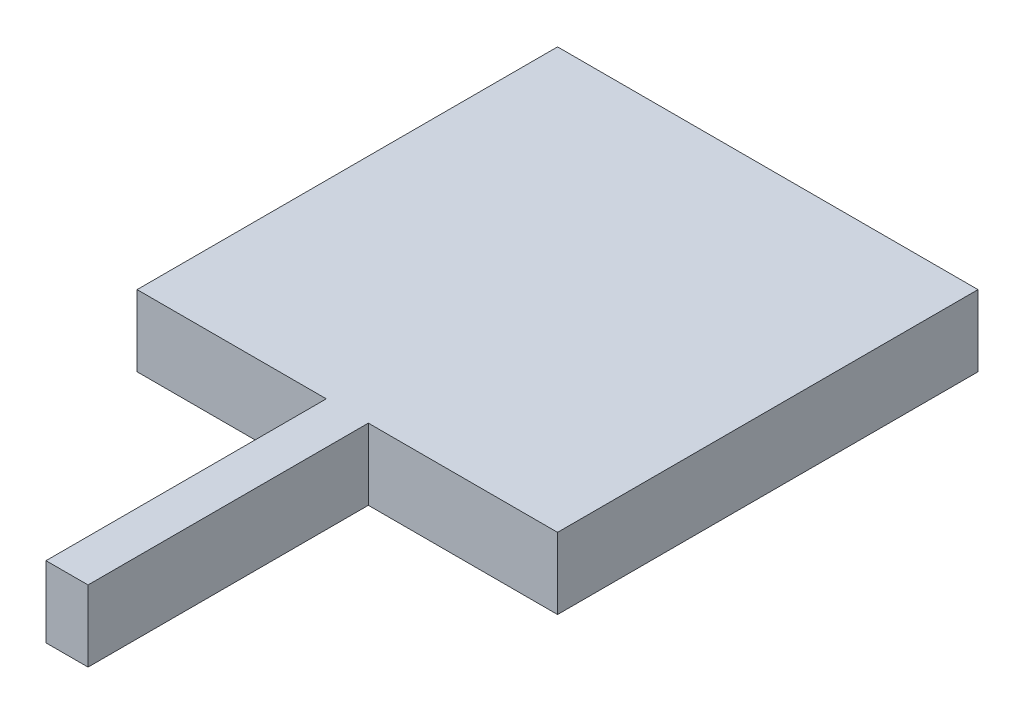
ISO-10303-21;
HEADER;
FILE_DESCRIPTION(('STEP AP214'),'2;1');
FILE_NAME('part.step','',(''),(''),'','','');
FILE_SCHEMA(('AUTOMOTIVE_DESIGN { 1 0 10303 214 1 1 1 1 }'));
ENDSEC;
DATA;
#1=APPLICATION_CONTEXT('core data for automotive mechanical design processes');
#2=APPLICATION_PROTOCOL_DEFINITION('international standard','automotive_design',2000,#1);
#3=PRODUCT_CONTEXT('',#1,'mechanical');
#4=PRODUCT('Part','Part','',(#3));
#5=PRODUCT_RELATED_PRODUCT_CATEGORY('part','',(#4));
#6=PRODUCT_DEFINITION_FORMATION('','',#4);
#7=PRODUCT_DEFINITION_CONTEXT('part definition',#1,'design');
#8=PRODUCT_DEFINITION('design','',#6,#7);
#9=PRODUCT_DEFINITION_SHAPE('','',#8);
#10=(LENGTH_UNIT() NAMED_UNIT(*) SI_UNIT(.MILLI.,.METRE.));
#11=(NAMED_UNIT(*) PLANE_ANGLE_UNIT() SI_UNIT($,.RADIAN.));
#12=(NAMED_UNIT(*) SI_UNIT($,.STERADIAN.) SOLID_ANGLE_UNIT());
#13=UNCERTAINTY_MEASURE_WITH_UNIT(LENGTH_MEASURE(1.E-05),#10,'distance_accuracy_value','');
#14=(GEOMETRIC_REPRESENTATION_CONTEXT(3) GLOBAL_UNCERTAINTY_ASSIGNED_CONTEXT((#13)) GLOBAL_UNIT_ASSIGNED_CONTEXT((#10,
#11,#12)) REPRESENTATION_CONTEXT('',''));
#15=CARTESIAN_POINT('',(0.,0.,0.));
#16=DIRECTION('',(0.,0.,1.));
#17=DIRECTION('',(1.,0.,0.));
#18=AXIS2_PLACEMENT_3D('',#15,#16,#17);
#19=CARTESIAN_POINT('',(0.,5.08,0.));
#20=DIRECTION('',(0.,0.,-1.));
#21=DIRECTION('',(-1.,0.,0.));
#22=AXIS2_PLACEMENT_3D('',#19,#20,#21);
#23=PLANE('',#22);
#24=DIRECTION('',(1.,0.,0.));
#25=VECTOR('',#24,1.);
#26=CARTESIAN_POINT('',(0.,0.,0.));
#27=LINE('',#26,#25);
#28=CARTESIAN_POINT('',(0.,0.,0.));
#29=VERTEX_POINT('',#28);
#30=CARTESIAN_POINT('',(13.5,0.,0.));
#31=VERTEX_POINT('',#30);
#32=EDGE_CURVE('E134',#29,#31,#27,.T.);
#33=ORIENTED_EDGE('',*,*,#32,.T.);
#34=DIRECTION('',(0.,-1.,0.));
#35=VECTOR('',#34,1.);
#36=CARTESIAN_POINT('',(13.5,5.08,0.));
#37=LINE('',#36,#35);
#38=CARTESIAN_POINT('',(13.5,5.08,0.));
#39=VERTEX_POINT('',#38);
#40=EDGE_CURVE('E11',#39,#31,#37,.T.);
#41=ORIENTED_EDGE('',*,*,#40,.F.);
#42=DIRECTION('',(1.,0.,0.));
#43=VECTOR('',#42,1.);
#44=CARTESIAN_POINT('',(0.,5.08,0.));
#45=LINE('',#44,#43);
#46=CARTESIAN_POINT('',(0.,5.08,0.));
#47=VERTEX_POINT('',#46);
#48=EDGE_CURVE('E151',#47,#39,#45,.T.);
#49=ORIENTED_EDGE('',*,*,#48,.F.);
#50=DIRECTION('',(0.,-1.,0.));
#51=VECTOR('',#50,1.);
#52=CARTESIAN_POINT('',(0.,5.08,0.));
#53=LINE('',#52,#51);
#54=EDGE_CURVE('E52',#47,#29,#53,.T.);
#55=ORIENTED_EDGE('',*,*,#54,.T.);
#56=EDGE_LOOP('',(#33,#41,#49,#55));
#57=FACE_BOUND('',#56,.T.);
#58=ADVANCED_FACE('F35',(#57),#23,.F.);
#59=CARTESIAN_POINT('',(13.5,5.08,0.));
#60=DIRECTION('',(1.,0.,0.));
#61=DIRECTION('',(0.,0.,-1.));
#62=AXIS2_PLACEMENT_3D('',#59,#60,#61);
#63=PLANE('',#62);
#64=DIRECTION('',(0.,0.,1.));
#65=VECTOR('',#64,1.);
#66=CARTESIAN_POINT('',(13.5,0.,0.));
#67=LINE('',#66,#65);
#68=CARTESIAN_POINT('',(13.5,0.,20.));
#69=VERTEX_POINT('',#68);
#70=EDGE_CURVE('E136',#31,#69,#67,.T.);
#71=ORIENTED_EDGE('',*,*,#70,.T.);
#72=DIRECTION('',(0.,-1.,0.));
#73=VECTOR('',#72,1.);
#74=CARTESIAN_POINT('',(13.5,5.08,20.));
#75=LINE('',#74,#73);
#76=CARTESIAN_POINT('',(13.5,5.08,20.));
#77=VERTEX_POINT('',#76);
#78=EDGE_CURVE('E44',#77,#69,#75,.T.);
#79=ORIENTED_EDGE('',*,*,#78,.F.);
#80=DIRECTION('',(0.,0.,1.));
#81=VECTOR('',#80,1.);
#82=CARTESIAN_POINT('',(13.5,5.08,0.));
#83=LINE('',#82,#81);
#84=EDGE_CURVE('E90',#39,#77,#83,.T.);
#85=ORIENTED_EDGE('',*,*,#84,.F.);
#86=ORIENTED_EDGE('',*,*,#40,.T.);
#87=EDGE_LOOP('',(#71,#79,#85,#86));
#88=FACE_BOUND('',#87,.T.);
#89=ADVANCED_FACE('F37',(#88),#63,.F.);
#90=CARTESIAN_POINT('',(0.,5.08,20.));
#91=DIRECTION('',(0.,0.,-1.));
#92=DIRECTION('',(-1.,0.,0.));
#93=AXIS2_PLACEMENT_3D('',#90,#91,#92);
#94=PLANE('',#93);
#95=DIRECTION('',(1.,0.,0.));
#96=VECTOR('',#95,1.);
#97=CARTESIAN_POINT('',(0.,0.,20.));
#98=LINE('',#97,#96);
#99=CARTESIAN_POINT('',(16.5,0.,20.));
#100=VERTEX_POINT('',#99);
#101=EDGE_CURVE('E139',#69,#100,#98,.T.);
#102=ORIENTED_EDGE('',*,*,#101,.T.);
#103=DIRECTION('',(0.,-1.,0.));
#104=VECTOR('',#103,1.);
#105=CARTESIAN_POINT('',(16.5,5.08,20.));
#106=LINE('',#105,#104);
#107=CARTESIAN_POINT('',(16.5,5.08,20.));
#108=VERTEX_POINT('',#107);
#109=EDGE_CURVE('E157',#108,#100,#106,.T.);
#110=ORIENTED_EDGE('',*,*,#109,.F.);
#111=DIRECTION('',(1.,0.,0.));
#112=VECTOR('',#111,1.);
#113=CARTESIAN_POINT('',(0.,5.08,20.));
#114=LINE('',#113,#112);
#115=EDGE_CURVE('E164',#77,#108,#114,.T.);
#116=ORIENTED_EDGE('',*,*,#115,.F.);
#117=ORIENTED_EDGE('',*,*,#78,.T.);
#118=EDGE_LOOP('',(#102,#110,#116,#117));
#119=FACE_BOUND('',#118,.T.);
#120=ADVANCED_FACE('F162',(#119),#94,.F.);
#121=CARTESIAN_POINT('',(16.5,5.08,0.));
#122=DIRECTION('',(1.,0.,0.));
#123=DIRECTION('',(0.,0.,-1.));
#124=AXIS2_PLACEMENT_3D('',#121,#122,#123);
#125=PLANE('',#124);
#126=DIRECTION('',(0.,0.,1.));
#127=VECTOR('',#126,1.);
#128=CARTESIAN_POINT('',(16.5,0.,0.));
#129=LINE('',#128,#127);
#130=CARTESIAN_POINT('',(16.5,0.,0.));
#131=VERTEX_POINT('',#130);
#132=EDGE_CURVE('E142',#131,#100,#129,.T.);
#133=ORIENTED_EDGE('',*,*,#132,.F.);
#134=DIRECTION('',(0.,-1.,0.));
#135=VECTOR('',#134,1.);
#136=CARTESIAN_POINT('',(16.5,5.08,0.));
#137=LINE('',#136,#135);
#138=CARTESIAN_POINT('',(16.5,5.08,0.));
#139=VERTEX_POINT('',#138);
#140=EDGE_CURVE('E155',#139,#131,#137,.T.);
#141=ORIENTED_EDGE('',*,*,#140,.F.);
#142=DIRECTION('',(0.,0.,1.));
#143=VECTOR('',#142,1.);
#144=CARTESIAN_POINT('',(16.5,5.08,0.));
#145=LINE('',#144,#143);
#146=EDGE_CURVE('E172',#139,#108,#145,.T.);
#147=ORIENTED_EDGE('',*,*,#146,.T.);
#148=ORIENTED_EDGE('',*,*,#109,.T.);
#149=EDGE_LOOP('',(#133,#141,#147,#148));
#150=FACE_BOUND('',#149,.T.);
#151=ADVANCED_FACE('F170',(#150),#125,.T.);
#152=CARTESIAN_POINT('',(30.,0.,0.));
#153=VERTEX_POINT('',#152);
#154=EDGE_CURVE('E137',#131,#153,#27,.T.);
#155=ORIENTED_EDGE('',*,*,#154,.T.);
#156=DIRECTION('',(0.,-1.,0.));
#157=VECTOR('',#156,1.);
#158=CARTESIAN_POINT('',(30.,5.08,0.));
#159=LINE('',#158,#157);
#160=CARTESIAN_POINT('',(30.,5.08,0.));
#161=VERTEX_POINT('',#160);
#162=EDGE_CURVE('E126',#161,#153,#159,.T.);
#163=ORIENTED_EDGE('',*,*,#162,.F.);
#164=EDGE_CURVE('E114',#139,#161,#45,.T.);
#165=ORIENTED_EDGE('',*,*,#164,.F.);
#166=ORIENTED_EDGE('',*,*,#140,.T.);
#167=EDGE_LOOP('',(#155,#163,#165,#166));
#168=FACE_BOUND('',#167,.T.);
#169=ADVANCED_FACE('F183',(#168),#23,.F.);
#170=CARTESIAN_POINT('',(30.,5.08,0.));
#171=DIRECTION('',(-1.,0.,0.));
#172=DIRECTION('',(0.,0.,1.));
#173=AXIS2_PLACEMENT_3D('',#170,#171,#172);
#174=PLANE('',#173);
#175=DIRECTION('',(0.,0.,-1.));
#176=VECTOR('',#175,1.);
#177=CARTESIAN_POINT('',(30.,0.,0.));
#178=LINE('',#177,#176);
#179=CARTESIAN_POINT('',(30.,0.,-30.));
#180=VERTEX_POINT('',#179);
#181=EDGE_CURVE('E123',#153,#180,#178,.T.);
#182=ORIENTED_EDGE('',*,*,#181,.T.);
#183=DIRECTION('',(0.,-1.,0.));
#184=VECTOR('',#183,1.);
#185=CARTESIAN_POINT('',(30.,5.08,-30.));
#186=LINE('',#185,#184);
#187=CARTESIAN_POINT('',(30.,5.08,-30.));
#188=VERTEX_POINT('',#187);
#189=EDGE_CURVE('E120',#188,#180,#186,.T.);
#190=ORIENTED_EDGE('',*,*,#189,.F.);
#191=DIRECTION('',(0.,0.,-1.));
#192=VECTOR('',#191,1.);
#193=CARTESIAN_POINT('',(30.,5.08,0.));
#194=LINE('',#193,#192);
#195=EDGE_CURVE('E106',#161,#188,#194,.T.);
#196=ORIENTED_EDGE('',*,*,#195,.F.);
#197=ORIENTED_EDGE('',*,*,#162,.T.);
#198=EDGE_LOOP('',(#182,#190,#196,#197));
#199=FACE_BOUND('',#198,.T.);
#200=ADVANCED_FACE('F121',(#199),#174,.F.);
#201=CARTESIAN_POINT('',(0.,5.08,-30.));
#202=DIRECTION('',(0.,0.,-1.));
#203=DIRECTION('',(-1.,0.,0.));
#204=AXIS2_PLACEMENT_3D('',#201,#202,#203);
#205=PLANE('',#204);
#206=DIRECTION('',(1.,0.,0.));
#207=VECTOR('',#206,1.);
#208=CARTESIAN_POINT('',(0.,0.,-30.));
#209=LINE('',#208,#207);
#210=CARTESIAN_POINT('',(0.,0.,-30.));
#211=VERTEX_POINT('',#210);
#212=EDGE_CURVE('E146',#211,#180,#209,.T.);
#213=ORIENTED_EDGE('',*,*,#212,.F.);
#214=DIRECTION('',(0.,-1.,0.));
#215=VECTOR('',#214,1.);
#216=CARTESIAN_POINT('',(0.,5.08,-30.));
#217=LINE('',#216,#215);
#218=CARTESIAN_POINT('',(0.,5.08,-30.));
#219=VERTEX_POINT('',#218);
#220=EDGE_CURVE('E78',#219,#211,#217,.T.);
#221=ORIENTED_EDGE('',*,*,#220,.F.);
#222=DIRECTION('',(1.,0.,0.));
#223=VECTOR('',#222,1.);
#224=CARTESIAN_POINT('',(0.,5.08,-30.));
#225=LINE('',#224,#223);
#226=EDGE_CURVE('E111',#219,#188,#225,.T.);
#227=ORIENTED_EDGE('',*,*,#226,.T.);
#228=ORIENTED_EDGE('',*,*,#189,.T.);
#229=EDGE_LOOP('',(#213,#221,#227,#228));
#230=FACE_BOUND('',#229,.T.);
#231=ADVANCED_FACE('F128',(#230),#205,.T.);
#232=CARTESIAN_POINT('',(0.,5.08,0.));
#233=DIRECTION('',(-1.,0.,0.));
#234=DIRECTION('',(0.,0.,1.));
#235=AXIS2_PLACEMENT_3D('',#232,#233,#234);
#236=PLANE('',#235);
#237=DIRECTION('',(0.,0.,-1.));
#238=VECTOR('',#237,1.);
#239=CARTESIAN_POINT('',(0.,0.,0.));
#240=LINE('',#239,#238);
#241=EDGE_CURVE('E148',#29,#211,#240,.T.);
#242=ORIENTED_EDGE('',*,*,#241,.F.);
#243=ORIENTED_EDGE('',*,*,#54,.F.);
#244=DIRECTION('',(0.,0.,-1.));
#245=VECTOR('',#244,1.);
#246=CARTESIAN_POINT('',(0.,5.08,0.));
#247=LINE('',#246,#245);
#248=EDGE_CURVE('E129',#47,#219,#247,.T.);
#249=ORIENTED_EDGE('',*,*,#248,.T.);
#250=ORIENTED_EDGE('',*,*,#220,.T.);
#251=EDGE_LOOP('',(#242,#243,#249,#250));
#252=FACE_BOUND('',#251,.T.);
#253=ADVANCED_FACE('F194',(#252),#236,.T.);
#254=CARTESIAN_POINT('',(0.,5.08,0.));
#255=DIRECTION('',(0.,1.,0.));
#256=DIRECTION('',(0.,0.,1.));
#257=AXIS2_PLACEMENT_3D('',#254,#255,#256);
#258=PLANE('',#257);
#259=ORIENTED_EDGE('',*,*,#48,.T.);
#260=ORIENTED_EDGE('',*,*,#84,.T.);
#261=ORIENTED_EDGE('',*,*,#115,.T.);
#262=ORIENTED_EDGE('',*,*,#146,.F.);
#263=ORIENTED_EDGE('',*,*,#164,.T.);
#264=ORIENTED_EDGE('',*,*,#195,.T.);
#265=ORIENTED_EDGE('',*,*,#226,.F.);
#266=ORIENTED_EDGE('',*,*,#248,.F.);
#267=EDGE_LOOP('',(#259,#260,#261,#262,#263,#264,#265,#266));
#268=FACE_BOUND('',#267,.T.);
#269=ADVANCED_FACE('F108',(#268),#258,.T.);
#270=CARTESIAN_POINT('',(0.,0.,0.));
#271=DIRECTION('',(0.,1.,0.));
#272=DIRECTION('',(0.,0.,1.));
#273=AXIS2_PLACEMENT_3D('',#270,#271,#272);
#274=PLANE('',#273);
#275=ORIENTED_EDGE('',*,*,#32,.F.);
#276=ORIENTED_EDGE('',*,*,#241,.T.);
#277=ORIENTED_EDGE('',*,*,#212,.T.);
#278=ORIENTED_EDGE('',*,*,#181,.F.);
#279=ORIENTED_EDGE('',*,*,#154,.F.);
#280=ORIENTED_EDGE('',*,*,#132,.T.);
#281=ORIENTED_EDGE('',*,*,#101,.F.);
#282=ORIENTED_EDGE('',*,*,#70,.F.);
#283=EDGE_LOOP('',(#275,#276,#277,#278,#279,#280,#281,#282));
#284=FACE_BOUND('',#283,.T.);
#285=ADVANCED_FACE('F166',(#284),#274,.F.);
#286=CLOSED_SHELL('',(#58,#89,#120,#151,#169,#200,#231,#253,#269,#285));
#287=MANIFOLD_SOLID_BREP('B2',#286);
#288=ADVANCED_BREP_SHAPE_REPRESENTATION('',(#18,#287),#14);
#289=SHAPE_DEFINITION_REPRESENTATION(#9,#288);
ENDSEC;
END-ISO-10303-21;
